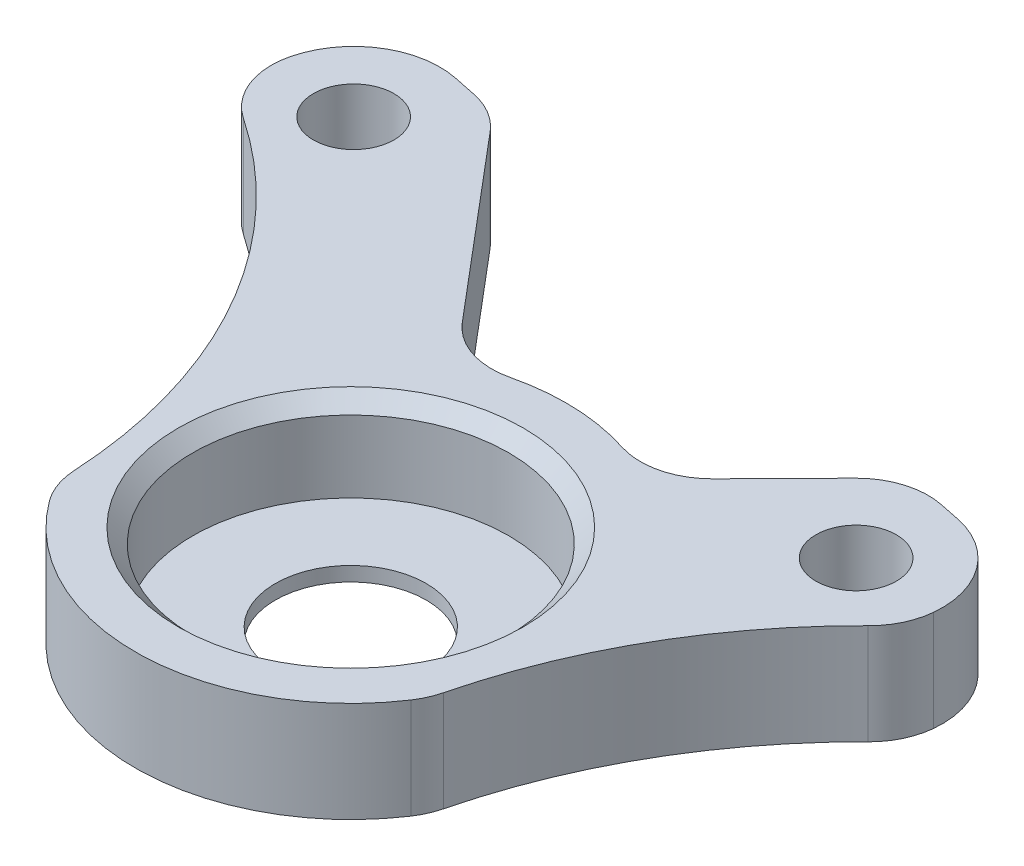
ISO-10303-21;
HEADER;
FILE_DESCRIPTION(('STEP AP214'),'2;1');
FILE_NAME('part.step','',(''),(''),'','','');
FILE_SCHEMA(('AUTOMOTIVE_DESIGN { 1 0 10303 214 1 1 1 1 }'));
ENDSEC;
DATA;
#1=APPLICATION_CONTEXT('core data for automotive mechanical design processes');
#2=APPLICATION_PROTOCOL_DEFINITION('international standard','automotive_design',2000,#1);
#3=PRODUCT_CONTEXT('',#1,'mechanical');
#4=PRODUCT('Part','Part','',(#3));
#5=PRODUCT_RELATED_PRODUCT_CATEGORY('part','',(#4));
#6=PRODUCT_DEFINITION_FORMATION('','',#4);
#7=PRODUCT_DEFINITION_CONTEXT('part definition',#1,'design');
#8=PRODUCT_DEFINITION('design','',#6,#7);
#9=PRODUCT_DEFINITION_SHAPE('','',#8);
#10=(LENGTH_UNIT() NAMED_UNIT(*) SI_UNIT(.MILLI.,.METRE.));
#11=(NAMED_UNIT(*) PLANE_ANGLE_UNIT() SI_UNIT($,.RADIAN.));
#12=(NAMED_UNIT(*) SI_UNIT($,.STERADIAN.) SOLID_ANGLE_UNIT());
#13=UNCERTAINTY_MEASURE_WITH_UNIT(LENGTH_MEASURE(1.E-05),#10,'distance_accuracy_value','');
#14=(GEOMETRIC_REPRESENTATION_CONTEXT(3) GLOBAL_UNCERTAINTY_ASSIGNED_CONTEXT((#13)) GLOBAL_UNIT_ASSIGNED_CONTEXT((#10,
#11,#12)) REPRESENTATION_CONTEXT('',''));
#15=CARTESIAN_POINT('',(0.,0.,0.));
#16=DIRECTION('',(0.,0.,1.));
#17=DIRECTION('',(1.,0.,0.));
#18=AXIS2_PLACEMENT_3D('',#15,#16,#17);
#19=CARTESIAN_POINT('',(-23.435152239211,6.,-30.7238893184095));
#20=DIRECTION('',(-0.202324195525961,0.,0.97931859979517));
#21=DIRECTION('',(0.97931859979517,0.,0.202324195525961));
#22=AXIS2_PLACEMENT_3D('',#19,#20,#21);
#23=PLANE('',#22);
#24=DIRECTION('',(-0.97931859979517,0.,-0.202324195525961));
#25=VECTOR('',#24,1.);
#26=CARTESIAN_POINT('',(-23.435152239211,6.,-30.7238893184095));
#27=LINE('',#26,#25);
#28=CARTESIAN_POINT('',(-21.8281383523247,6.,-30.3918852168522));
#29=VERTEX_POINT('',#28);
#30=CARTESIAN_POINT('',(-23.435152239211,6.,-30.7238893184095));
#31=VERTEX_POINT('',#30);
#32=EDGE_CURVE('E269',#29,#31,#27,.T.);
#33=ORIENTED_EDGE('',*,*,#32,.F.);
#34=DIRECTION('',(0.,1.,0.));
#35=VECTOR('',#34,1.);
#36=CARTESIAN_POINT('',(-21.8281383523247,6.,-30.3918852168522));
#37=LINE('',#36,#35);
#38=CARTESIAN_POINT('',(-21.8281383523247,-1.,-30.3918852168522));
#39=VERTEX_POINT('',#38);
#40=EDGE_CURVE('E200',#29,#39,#37,.F.);
#41=ORIENTED_EDGE('',*,*,#40,.T.);
#42=DIRECTION('',(0.97931859979517,0.,0.202324195525962));
#43=VECTOR('',#42,1.);
#44=CARTESIAN_POINT('',(-23.435152239211,-1.,-30.7238893184095));
#45=LINE('',#44,#43);
#46=CARTESIAN_POINT('',(-23.435152239211,-1.,-30.7238893184095));
#47=VERTEX_POINT('',#46);
#48=EDGE_CURVE('E180',#47,#39,#45,.T.);
#49=ORIENTED_EDGE('',*,*,#48,.F.);
#50=DIRECTION('',(0.,-1.,0.));
#51=VECTOR('',#50,1.);
#52=CARTESIAN_POINT('',(-23.435152239211,6.,-30.7238893184095));
#53=LINE('',#52,#51);
#54=EDGE_CURVE('E191',#31,#47,#53,.T.);
#55=ORIENTED_EDGE('',*,*,#54,.F.);
#56=EDGE_LOOP('',(#33,#41,#49,#55));
#57=FACE_BOUND('',#56,.T.);
#58=ADVANCED_FACE('F47',(#57),#23,.F.);
#59=CARTESIAN_POINT('',(0.,6.,0.));
#60=DIRECTION('',(0.,1.,0.));
#61=DIRECTION('',(0.,0.,1.));
#62=AXIS2_PLACEMENT_3D('',#59,#60,#61);
#63=PLANE('',#62);
#64=CARTESIAN_POINT('',(0.,6.,0.));
#65=DIRECTION('',(0.,1.,0.));
#66=DIRECTION('',(0.,0.,1.));
#67=AXIS2_PLACEMENT_3D('',#64,#65,#66);
#68=CIRCLE('',#67,15.);
#69=CARTESIAN_POINT('',(-12.0900974623236,6.,8.8786003036242));
#70=VERTEX_POINT('',#69);
#71=CARTESIAN_POINT('',(12.4953737752956,6.,8.29853205185444));
#72=VERTEX_POINT('',#71);
#73=EDGE_CURVE('E262',#70,#72,#68,.T.);
#74=ORIENTED_EDGE('',*,*,#73,.T.);
#75=CARTESIAN_POINT('',(8.33024918353037,6.,5.53235470123628));
#76=DIRECTION('',(0.,1.,0.));
#77=DIRECTION('',(0.,0.,1.));
#78=AXIS2_PLACEMENT_3D('',#75,#76,#77);
#79=CIRCLE('',#78,5.);
#80=CARTESIAN_POINT('',(13.1818907908236,6.,6.74131033085247));
#81=VERTEX_POINT('',#80);
#82=EDGE_CURVE('E332',#72,#81,#79,.T.);
#83=ORIENTED_EDGE('',*,*,#82,.T.);
#84=CARTESIAN_POINT('',(51.9950236491699,6.,16.412955367782));
#85=DIRECTION('',(0.,1.,0.));
#86=DIRECTION('',(0.,0.,1.));
#87=AXIS2_PLACEMENT_3D('',#84,#85,#86);
#88=CIRCLE('',#87,40.);
#89=CARTESIAN_POINT('',(23.9242574265755,6.,-12.0832212823662));
#90=VERTEX_POINT('',#89);
#91=EDGE_CURVE('E232',#90,#81,#88,.T.);
#92=ORIENTED_EDGE('',*,*,#91,.F.);
#93=CARTESIAN_POINT('',(20.4154116487512,6.,-15.6452433636347));
#94=DIRECTION('',(0.,1.,0.));
#95=DIRECTION('',(0.,0.,1.));
#96=AXIS2_PLACEMENT_3D('',#93,#94,#95);
#97=CIRCLE('',#96,5.);
#98=CARTESIAN_POINT('',(25.3912720004273,6.,-15.1545155769571));
#99=VERTEX_POINT('',#98);
#100=EDGE_CURVE('E326',#90,#99,#97,.T.);
#101=ORIENTED_EDGE('',*,*,#100,.T.);
#102=CARTESIAN_POINT('',(19.4202395784159,6.,-15.7433889209702));
#103=DIRECTION('',(0.,1.,0.));
#104=DIRECTION('',(0.,0.,-1.));
#105=AXIS2_PLACEMENT_3D('',#102,#103,#104);
#106=CIRCLE('',#105,6.);
#107=CARTESIAN_POINT('',(20.6341847515717,6.,-21.6193005197413));
#108=VERTEX_POINT('',#107);
#109=EDGE_CURVE('E266',#99,#108,#106,.T.);
#110=ORIENTED_EDGE('',*,*,#109,.T.);
#111=CARTESIAN_POINT('',(19.1682255894527,6.,-21.9221631511787));
#112=VERTEX_POINT('',#111);
#113=EDGE_CURVE('E270',#108,#112,#27,.T.);
#114=ORIENTED_EDGE('',*,*,#113,.T.);
#115=CARTESIAN_POINT('',(18.1566046118229,6.,-17.0255701522029));
#116=DIRECTION('',(0.,1.,0.));
#117=DIRECTION('',(0.,0.,1.));
#118=AXIS2_PLACEMENT_3D('',#115,#116,#117);
#119=CIRCLE('',#118,5.);
#120=CARTESIAN_POINT('',(14.5927242909585,6.,-20.5325285292806));
#121=VERTEX_POINT('',#120);
#122=EDGE_CURVE('E318',#112,#121,#119,.T.);
#123=ORIENTED_EDGE('',*,*,#122,.T.);
#124=DIRECTION('',(0.701391675415538,0.,-0.712776064172882));
#125=VECTOR('',#124,1.);
#126=CARTESIAN_POINT('',(7.28879756776038,6.,-13.1100507251578));
#127=LINE('',#126,#125);
#128=CARTESIAN_POINT('',(9.67615163065933,6.,-15.5361542738378));
#129=VERTEX_POINT('',#128);
#130=EDGE_CURVE('E242',#129,#121,#127,.T.);
#131=ORIENTED_EDGE('',*,*,#130,.F.);
#132=CARTESIAN_POINT('',(6.11227130979492,6.,-19.0431126509155));
#133=DIRECTION('',(0.,1.,0.));
#134=DIRECTION('',(0.,0.,1.));
#135=AXIS2_PLACEMENT_3D('',#132,#133,#134);
#136=CIRCLE('',#135,5.);
#137=CARTESIAN_POINT('',(4.58420348234619,6.,-14.2823344881866));
#138=VERTEX_POINT('',#137);
#139=EDGE_CURVE('E56',#129,#138,#136,.F.);
#140=ORIENTED_EDGE('',*,*,#139,.T.);
#141=CARTESIAN_POINT('',(0.,6.,0.));
#142=DIRECTION('',(0.,-1.,0.));
#143=DIRECTION('',(0.,0.,-1.));
#144=AXIS2_PLACEMENT_3D('',#141,#142,#143);
#145=CIRCLE('',#144,15.);
#146=CARTESIAN_POINT('',(-3.48577714933836,6.,-14.5893576851467));
#147=VERTEX_POINT('',#146);
#148=EDGE_CURVE('E236',#147,#138,#145,.T.);
#149=ORIENTED_EDGE('',*,*,#148,.F.);
#150=CARTESIAN_POINT('',(-4.64770286578448,6.,-19.452476913529));
#151=DIRECTION('',(0.,1.,0.));
#152=DIRECTION('',(0.,0.,1.));
#153=AXIS2_PLACEMENT_3D('',#150,#151,#152);
#154=CIRCLE('',#153,5.);
#155=CARTESIAN_POINT('',(-8.46774063057506,6.,-16.2264404172113));
#156=VERTEX_POINT('',#155);
#157=EDGE_CURVE('E375',#147,#156,#154,.F.);
#158=ORIENTED_EDGE('',*,*,#157,.T.);
#159=DIRECTION('',(0.645207299263541,0.,0.764007552958115));
#160=VECTOR('',#159,1.);
#161=CARTESIAN_POINT('',(-6.271623509002,6.,-13.6259582621309));
#162=LINE('',#161,#160);
#163=CARTESIAN_POINT('',(-19.0197215651639,6.,-28.7213287141941));
#164=VERTEX_POINT('',#163);
#165=EDGE_CURVE('E246',#164,#156,#162,.T.);
#166=ORIENTED_EDGE('',*,*,#165,.F.);
#167=CARTESIAN_POINT('',(-22.8397593299545,6.,-25.4952922178764));
#168=DIRECTION('',(0.,1.,0.));
#169=DIRECTION('',(0.,0.,1.));
#170=AXIS2_PLACEMENT_3D('',#167,#168,#169);
#171=CIRCLE('',#170,5.);
#172=EDGE_CURVE('E321',#164,#29,#171,.T.);
#173=ORIENTED_EDGE('',*,*,#172,.T.);
#174=ORIENTED_EDGE('',*,*,#32,.T.);
#175=CARTESIAN_POINT('',(-24.6490974123668,6.,-24.8479777196385));
#176=DIRECTION('',(0.,1.,0.));
#177=DIRECTION('',(0.,0.,-1.));
#178=AXIS2_PLACEMENT_3D('',#175,#176,#177);
#179=CIRCLE('',#178,6.00000000000001);
#180=CARTESIAN_POINT('',(-30.4770671423651,6.,-26.2744309527394));
#181=VERTEX_POINT('',#180);
#182=EDGE_CURVE('E193',#31,#181,#179,.T.);
#183=ORIENTED_EDGE('',*,*,#182,.T.);
#184=CARTESIAN_POINT('',(-25.6204257006997,6.,-25.0857199251553));
#185=DIRECTION('',(0.,1.,0.));
#186=DIRECTION('',(0.,0.,1.));
#187=AXIS2_PLACEMENT_3D('',#184,#185,#186);
#188=CIRCLE('',#187,5.);
#189=CARTESIAN_POINT('',(-28.4181722581908,6.,-20.9417346211217));
#190=VERTEX_POINT('',#189);
#191=EDGE_CURVE('E63',#181,#190,#188,.T.);
#192=ORIENTED_EDGE('',*,*,#191,.T.);
#193=CARTESIAN_POINT('',(-48.0023981606285,6.,8.06616250711379));
#194=DIRECTION('',(0.,1.,0.));
#195=DIRECTION('',(0.,0.,-1.));
#196=AXIS2_PLACEMENT_3D('',#193,#194,#195);
#197=CIRCLE('',#196,35.);
#198=CARTESIAN_POINT('',(-13.0528566231007,6.,6.18745382383667));
#199=VERTEX_POINT('',#198);
#200=EDGE_CURVE('E231',#199,#190,#197,.T.);
#201=ORIENTED_EDGE('',*,*,#200,.F.);
#202=CARTESIAN_POINT('',(-8.06006497488243,6.,5.9190668690828));
#203=DIRECTION('',(0.,1.,0.));
#204=DIRECTION('',(0.,0.,1.));
#205=AXIS2_PLACEMENT_3D('',#202,#203,#204);
#206=CIRCLE('',#205,5.);
#207=EDGE_CURVE('E329',#199,#70,#206,.T.);
#208=ORIENTED_EDGE('',*,*,#207,.T.);
#209=EDGE_LOOP('',(#74,#83,#92,#101,#110,#114,#123,#131,#140,#149,#158,#166,#173,#174,#183,#192,
#201,#208));
#210=FACE_BOUND('',#209,.T.);
#211=CARTESIAN_POINT('',(0.,6.,0.));
#212=DIRECTION('',(0.,1.,0.));
#213=DIRECTION('',(0.,0.,1.));
#214=AXIS2_PLACEMENT_3D('',#211,#212,#213);
#215=CIRCLE('',#214,12.);
#216=CARTESIAN_POINT('',(0.,6.,12.));
#217=VERTEX_POINT('',#216);
#218=EDGE_CURVE('E283',#217,#217,#215,.F.);
#219=ORIENTED_EDGE('',*,*,#218,.T.);
#220=EDGE_LOOP('',(#219));
#221=FACE_BOUND('',#220,.T.);
#222=CARTESIAN_POINT('',(19.4202395784159,6.,-15.7433889209702));
#223=DIRECTION('',(0.,1.,0.));
#224=DIRECTION('',(0.,0.,1.));
#225=AXIS2_PLACEMENT_3D('',#222,#223,#224);
#226=CIRCLE('',#225,2.8);
#227=CARTESIAN_POINT('',(19.4202395784159,6.,-12.9433889209702));
#228=VERTEX_POINT('',#227);
#229=EDGE_CURVE('E254',#228,#228,#226,.T.);
#230=ORIENTED_EDGE('',*,*,#229,.F.);
#231=EDGE_LOOP('',(#230));
#232=FACE_BOUND('',#231,.T.);
#233=CARTESIAN_POINT('',(-24.6490974123668,6.,-24.8479777196385));
#234=DIRECTION('',(0.,1.,0.));
#235=DIRECTION('',(0.,0.,1.));
#236=AXIS2_PLACEMENT_3D('',#233,#234,#235);
#237=CIRCLE('',#236,2.8);
#238=CARTESIAN_POINT('',(-24.6490974123668,6.,-22.0479777196385));
#239=VERTEX_POINT('',#238);
#240=EDGE_CURVE('E250',#239,#239,#237,.T.);
#241=ORIENTED_EDGE('',*,*,#240,.F.);
#242=EDGE_LOOP('',(#241));
#243=FACE_BOUND('',#242,.T.);
#244=ADVANCED_FACE('F383',(#210,#221,#232,#243),#63,.T.);
#245=CARTESIAN_POINT('',(0.,6.,0.));
#246=DIRECTION('',(0.,-1.,0.));
#247=DIRECTION('',(0.,0.,-1.));
#248=AXIS2_PLACEMENT_3D('',#245,#246,#247);
#249=CYLINDRICAL_SURFACE('',#248,15.);
#250=CARTESIAN_POINT('',(0.,-1.,0.));
#251=DIRECTION('',(0.,-1.,0.));
#252=DIRECTION('',(0.,0.,-1.));
#253=AXIS2_PLACEMENT_3D('',#250,#251,#252);
#254=CIRCLE('',#253,15.);
#255=CARTESIAN_POINT('',(12.4953737752956,-1.,8.29853205185444));
#256=VERTEX_POINT('',#255);
#257=CARTESIAN_POINT('',(-12.0900974623236,-1.,8.8786003036242));
#258=VERTEX_POINT('',#257);
#259=EDGE_CURVE('E227',#256,#258,#254,.T.);
#260=ORIENTED_EDGE('',*,*,#259,.F.);
#261=DIRECTION('',(0.,-1.,0.));
#262=VECTOR('',#261,1.);
#263=CARTESIAN_POINT('',(12.4953737752956,6.,8.29853205185444));
#264=LINE('',#263,#262);
#265=EDGE_CURVE('E315',#256,#72,#264,.F.);
#266=ORIENTED_EDGE('',*,*,#265,.T.);
#267=ORIENTED_EDGE('',*,*,#73,.F.);
#268=DIRECTION('',(0.,-1.,0.));
#269=VECTOR('',#268,1.);
#270=CARTESIAN_POINT('',(-12.0900974623236,6.,8.8786003036242));
#271=LINE('',#270,#269);
#272=EDGE_CURVE('E311',#70,#258,#271,.T.);
#273=ORIENTED_EDGE('',*,*,#272,.T.);
#274=EDGE_LOOP('',(#260,#266,#267,#273));
#275=FACE_BOUND('',#274,.T.);
#276=ADVANCED_FACE('F426',(#275),#249,.T.);
#277=CARTESIAN_POINT('',(19.4202395784159,6.,-15.7433889209702));
#278=DIRECTION('',(0.,-1.,0.));
#279=DIRECTION('',(0.,0.,-1.));
#280=AXIS2_PLACEMENT_3D('',#277,#278,#279);
#281=CYLINDRICAL_SURFACE('',#280,6.);
#282=ORIENTED_EDGE('',*,*,#109,.F.);
#283=DIRECTION('',(0.,-1.,0.));
#284=VECTOR('',#283,1.);
#285=CARTESIAN_POINT('',(25.3912720004273,6.,-15.1545155769571));
#286=LINE('',#285,#284);
#287=CARTESIAN_POINT('',(25.3912720004273,-1.,-15.1545155769571));
#288=VERTEX_POINT('',#287);
#289=EDGE_CURVE('E341',#99,#288,#286,.T.);
#290=ORIENTED_EDGE('',*,*,#289,.T.);
#291=CARTESIAN_POINT('',(19.4202395784159,-1.,-15.7433889209702));
#292=DIRECTION('',(0.,-1.,0.));
#293=DIRECTION('',(0.,0.,-1.));
#294=AXIS2_PLACEMENT_3D('',#291,#292,#293);
#295=CIRCLE('',#294,6.);
#296=CARTESIAN_POINT('',(20.6341847515717,-1.,-21.6193005197413));
#297=VERTEX_POINT('',#296);
#298=EDGE_CURVE('E220',#297,#288,#295,.T.);
#299=ORIENTED_EDGE('',*,*,#298,.F.);
#300=DIRECTION('',(0.,-1.,0.));
#301=VECTOR('',#300,1.);
#302=CARTESIAN_POINT('',(20.6341847515717,6.,-21.6193005197413));
#303=LINE('',#302,#301);
#304=EDGE_CURVE('E197',#108,#297,#303,.T.);
#305=ORIENTED_EDGE('',*,*,#304,.F.);
#306=EDGE_LOOP('',(#282,#290,#299,#305));
#307=FACE_BOUND('',#306,.T.);
#308=ADVANCED_FACE('F409',(#307),#281,.T.);
#309=DIRECTION('',(0.97931859979517,0.,0.202324195525964));
#310=VECTOR('',#309,1.);
#311=CARTESIAN_POINT('',(16.5021661316794,-1.,-22.4729627940439));
#312=LINE('',#311,#310);
#313=CARTESIAN_POINT('',(19.1682255894527,-1.,-21.9221631511787));
#314=VERTEX_POINT('',#313);
#315=EDGE_CURVE('E217',#314,#297,#312,.T.);
#316=ORIENTED_EDGE('',*,*,#315,.F.);
#317=DIRECTION('',(0.,1.,0.));
#318=VECTOR('',#317,1.);
#319=CARTESIAN_POINT('',(19.1682255894527,6.,-21.9221631511787));
#320=LINE('',#319,#318);
#321=EDGE_CURVE('E371',#314,#112,#320,.T.);
#322=ORIENTED_EDGE('',*,*,#321,.T.);
#323=ORIENTED_EDGE('',*,*,#113,.F.);
#324=ORIENTED_EDGE('',*,*,#304,.T.);
#325=EDGE_LOOP('',(#316,#322,#323,#324));
#326=FACE_BOUND('',#325,.T.);
#327=ADVANCED_FACE('F403',(#326),#23,.F.);
#328=CARTESIAN_POINT('',(-24.6490974123668,6.,-24.8479777196385));
#329=DIRECTION('',(0.,-1.,0.));
#330=DIRECTION('',(0.,0.,-1.));
#331=AXIS2_PLACEMENT_3D('',#328,#329,#330);
#332=CYLINDRICAL_SURFACE('',#331,6.00000000000001);
#333=CARTESIAN_POINT('',(-24.6490974123668,-1.,-24.8479777196385));
#334=DIRECTION('',(0.,-1.,0.));
#335=DIRECTION('',(0.,0.,-1.));
#336=AXIS2_PLACEMENT_3D('',#333,#334,#335);
#337=CIRCLE('',#336,6.00000000000002);
#338=CARTESIAN_POINT('',(-30.4770671423651,-1.,-26.2744309527394));
#339=VERTEX_POINT('',#338);
#340=EDGE_CURVE('E174',#339,#47,#337,.T.);
#341=ORIENTED_EDGE('',*,*,#340,.F.);
#342=DIRECTION('',(0.,-1.,0.));
#343=VECTOR('',#342,1.);
#344=CARTESIAN_POINT('',(-30.4770671423651,6.,-26.2744309527394));
#345=LINE('',#344,#343);
#346=EDGE_CURVE('E345',#339,#181,#345,.F.);
#347=ORIENTED_EDGE('',*,*,#346,.T.);
#348=ORIENTED_EDGE('',*,*,#182,.F.);
#349=ORIENTED_EDGE('',*,*,#54,.T.);
#350=EDGE_LOOP('',(#341,#347,#348,#349));
#351=FACE_BOUND('',#350,.T.);
#352=ADVANCED_FACE('F192',(#351),#332,.T.);
#353=CARTESIAN_POINT('',(0.,6.,0.));
#354=DIRECTION('',(0.,-1.,0.));
#355=DIRECTION('',(0.,0.,-1.));
#356=AXIS2_PLACEMENT_3D('',#353,#354,#355);
#357=CYLINDRICAL_SURFACE('',#356,11.);
#358=CARTESIAN_POINT('',(0.,5.,0.));
#359=DIRECTION('',(0.,1.,0.));
#360=DIRECTION('',(0.,0.,1.));
#361=AXIS2_PLACEMENT_3D('',#358,#359,#360);
#362=CIRCLE('',#361,11.);
#363=CARTESIAN_POINT('',(0.,5.,11.));
#364=VERTEX_POINT('',#363);
#365=EDGE_CURVE('E279',#364,#364,#362,.T.);
#366=ORIENTED_EDGE('',*,*,#365,.T.);
#367=EDGE_LOOP('',(#366));
#368=FACE_BOUND('',#367,.T.);
#369=CARTESIAN_POINT('',(0.,0.,0.));
#370=DIRECTION('',(0.,1.,0.));
#371=DIRECTION('',(0.,0.,1.));
#372=AXIS2_PLACEMENT_3D('',#369,#370,#371);
#373=CIRCLE('',#372,11.);
#374=CARTESIAN_POINT('',(0.,0.,11.));
#375=VERTEX_POINT('',#374);
#376=EDGE_CURVE('E258',#375,#375,#373,.T.);
#377=ORIENTED_EDGE('',*,*,#376,.F.);
#378=EDGE_LOOP('',(#377));
#379=FACE_BOUND('',#378,.T.);
#380=ADVANCED_FACE('F483',(#368,#379),#357,.F.);
#381=CARTESIAN_POINT('',(19.4202395784159,6.,-15.7433889209702));
#382=DIRECTION('',(0.,-1.,0.));
#383=DIRECTION('',(0.,0.,-1.));
#384=AXIS2_PLACEMENT_3D('',#381,#382,#383);
#385=CYLINDRICAL_SURFACE('',#384,2.8);
#386=ORIENTED_EDGE('',*,*,#229,.T.);
#387=EDGE_LOOP('',(#386));
#388=FACE_BOUND('',#387,.T.);
#389=CARTESIAN_POINT('',(19.4202395784159,-1.,-15.7433889209702));
#390=DIRECTION('',(0.,-1.,0.));
#391=DIRECTION('',(0.,0.,-1.));
#392=AXIS2_PLACEMENT_3D('',#389,#390,#391);
#393=CIRCLE('',#392,2.8);
#394=CARTESIAN_POINT('',(19.4202395784159,-1.,-18.5433889209702));
#395=VERTEX_POINT('',#394);
#396=EDGE_CURVE('E435',#395,#395,#393,.T.);
#397=ORIENTED_EDGE('',*,*,#396,.T.);
#398=EDGE_LOOP('',(#397));
#399=FACE_BOUND('',#398,.T.);
#400=ADVANCED_FACE('F638',(#388,#399),#385,.F.);
#401=CARTESIAN_POINT('',(-24.6490974123668,6.,-24.8479777196385));
#402=DIRECTION('',(0.,-1.,0.));
#403=DIRECTION('',(0.,0.,-1.));
#404=AXIS2_PLACEMENT_3D('',#401,#402,#403);
#405=CYLINDRICAL_SURFACE('',#404,2.8);
#406=ORIENTED_EDGE('',*,*,#240,.T.);
#407=EDGE_LOOP('',(#406));
#408=FACE_BOUND('',#407,.T.);
#409=CARTESIAN_POINT('',(-24.6490974123668,-1.,-24.8479777196385));
#410=DIRECTION('',(0.,-1.,0.));
#411=DIRECTION('',(0.,0.,-1.));
#412=AXIS2_PLACEMENT_3D('',#409,#410,#411);
#413=CIRCLE('',#412,2.8);
#414=CARTESIAN_POINT('',(-24.6490974123668,-1.,-27.6479777196385));
#415=VERTEX_POINT('',#414);
#416=EDGE_CURVE('E438',#415,#415,#413,.T.);
#417=ORIENTED_EDGE('',*,*,#416,.T.);
#418=EDGE_LOOP('',(#417));
#419=FACE_BOUND('',#418,.T.);
#420=ADVANCED_FACE('F627',(#408,#419),#405,.F.);
#421=CARTESIAN_POINT('',(0.,-0.00100000000000013,0.));
#422=DIRECTION('',(0.,1.,0.));
#423=DIRECTION('',(0.,0.,1.));
#424=AXIS2_PLACEMENT_3D('',#421,#422,#423);
#425=CYLINDRICAL_SURFACE('',#424,15.);
#426=CARTESIAN_POINT('',(0.,-1.,0.));
#427=DIRECTION('',(0.,-1.,0.));
#428=DIRECTION('',(0.,0.,-1.));
#429=AXIS2_PLACEMENT_3D('',#426,#427,#428);
#430=CIRCLE('',#429,15.);
#431=CARTESIAN_POINT('',(-3.48577714933836,-1.,-14.5893576851467));
#432=VERTEX_POINT('',#431);
#433=CARTESIAN_POINT('',(4.58420348234619,-1.,-14.2823344881866));
#434=VERTEX_POINT('',#433);
#435=EDGE_CURVE('E206',#432,#434,#430,.T.);
#436=ORIENTED_EDGE('',*,*,#435,.F.);
#437=DIRECTION('',(0.,1.,0.));
#438=VECTOR('',#437,1.);
#439=CARTESIAN_POINT('',(-3.48577714933836,-0.00100000000000013,-14.5893576851467));
#440=LINE('',#439,#438);
#441=EDGE_CURVE('E360',#432,#147,#440,.T.);
#442=ORIENTED_EDGE('',*,*,#441,.T.);
#443=ORIENTED_EDGE('',*,*,#148,.T.);
#444=DIRECTION('',(0.,1.,0.));
#445=VECTOR('',#444,1.);
#446=CARTESIAN_POINT('',(4.58420348234619,-0.00100000000000013,-14.2823344881866));
#447=LINE('',#446,#445);
#448=EDGE_CURVE('E357',#138,#434,#447,.F.);
#449=ORIENTED_EDGE('',*,*,#448,.T.);
#450=EDGE_LOOP('',(#436,#442,#443,#449));
#451=FACE_BOUND('',#450,.T.);
#452=ADVANCED_FACE('F390',(#451),#425,.T.);
#453=CARTESIAN_POINT('',(-6.271623509002,-0.00100000000000013,-13.6259582621309));
#454=DIRECTION('',(-0.764007552958115,0.,0.645207299263541));
#455=DIRECTION('',(0.645207299263541,0.,0.764007552958115));
#456=AXIS2_PLACEMENT_3D('',#453,#454,#455);
#457=PLANE('',#456);
#458=DIRECTION('',(0.645207299263541,0.,0.764007552958115));
#459=VECTOR('',#458,1.);
#460=CARTESIAN_POINT('',(-20.1351306894507,-1.,-30.042115066993));
#461=LINE('',#460,#459);
#462=CARTESIAN_POINT('',(-19.0197215651639,-1.,-28.7213287141941));
#463=VERTEX_POINT('',#462);
#464=CARTESIAN_POINT('',(-8.46774063057506,-1.,-16.2264404172113));
#465=VERTEX_POINT('',#464);
#466=EDGE_CURVE('E202',#463,#465,#461,.T.);
#467=ORIENTED_EDGE('',*,*,#466,.F.);
#468=DIRECTION('',(0.,1.,0.));
#469=VECTOR('',#468,1.);
#470=CARTESIAN_POINT('',(-19.0197215651639,-0.00100000000000013,-28.7213287141941));
#471=LINE('',#470,#469);
#472=EDGE_CURVE('E351',#463,#164,#471,.T.);
#473=ORIENTED_EDGE('',*,*,#472,.T.);
#474=ORIENTED_EDGE('',*,*,#165,.T.);
#475=DIRECTION('',(0.,-1.,0.));
#476=VECTOR('',#475,1.);
#477=CARTESIAN_POINT('',(-8.46774063057506,-1.,-16.2264404172113));
#478=LINE('',#477,#476);
#479=EDGE_CURVE('E348',#156,#465,#478,.T.);
#480=ORIENTED_EDGE('',*,*,#479,.T.);
#481=EDGE_LOOP('',(#467,#473,#474,#480));
#482=FACE_BOUND('',#481,.T.);
#483=ADVANCED_FACE('F605',(#482),#457,.F.);
#484=CARTESIAN_POINT('',(7.28879756776038,-0.00100000000000013,-13.1100507251578));
#485=DIRECTION('',(0.712776064172882,0.,0.701391675415538));
#486=DIRECTION('',(0.701391675415538,0.,-0.712776064172882));
#487=AXIS2_PLACEMENT_3D('',#484,#485,#486);
#488=PLANE('',#487);
#489=DIRECTION('',(0.701391675415538,0.,-0.712776064172882));
#490=VECTOR('',#489,1.);
#491=CARTESIAN_POINT('',(7.28879756776037,-1.,-13.1100507251578));
#492=LINE('',#491,#490);
#493=CARTESIAN_POINT('',(9.67615163065933,-1.,-15.5361542738378));
#494=VERTEX_POINT('',#493);
#495=CARTESIAN_POINT('',(14.5927242909585,-1.,-20.5325285292806));
#496=VERTEX_POINT('',#495);
#497=EDGE_CURVE('E213',#494,#496,#492,.T.);
#498=ORIENTED_EDGE('',*,*,#497,.F.);
#499=DIRECTION('',(0.,-1.,0.));
#500=VECTOR('',#499,1.);
#501=CARTESIAN_POINT('',(9.67615163065933,6.,-15.5361542738378));
#502=LINE('',#501,#500);
#503=EDGE_CURVE('E367',#494,#129,#502,.F.);
#504=ORIENTED_EDGE('',*,*,#503,.T.);
#505=ORIENTED_EDGE('',*,*,#130,.T.);
#506=DIRECTION('',(0.,1.,0.));
#507=VECTOR('',#506,1.);
#508=CARTESIAN_POINT('',(14.5927242909585,-0.00100000000000013,-20.5325285292806));
#509=LINE('',#508,#507);
#510=EDGE_CURVE('E364',#121,#496,#509,.F.);
#511=ORIENTED_EDGE('',*,*,#510,.T.);
#512=EDGE_LOOP('',(#498,#504,#505,#511));
#513=FACE_BOUND('',#512,.T.);
#514=ADVANCED_FACE('F397',(#513),#488,.F.);
#515=CARTESIAN_POINT('',(0.,5.,0.));
#516=DIRECTION('',(0.,1.,0.));
#517=DIRECTION('',(0.,0.,1.));
#518=AXIS2_PLACEMENT_3D('',#515,#516,#517);
#519=CONICAL_SURFACE('',#518,11.,0.785398163397447);
#520=ORIENTED_EDGE('',*,*,#218,.F.);
#521=EDGE_LOOP('',(#520));
#522=FACE_BOUND('',#521,.T.);
#523=ORIENTED_EDGE('',*,*,#365,.F.);
#524=EDGE_LOOP('',(#523));
#525=FACE_BOUND('',#524,.T.);
#526=ADVANCED_FACE('F490',(#522,#525),#519,.F.);
#527=CARTESIAN_POINT('',(-48.0023981606285,0.,8.06616250711379));
#528=DIRECTION('',(0.,1.,0.));
#529=DIRECTION('',(0.,0.,1.));
#530=AXIS2_PLACEMENT_3D('',#527,#528,#529);
#531=CYLINDRICAL_SURFACE('',#530,35.);
#532=CARTESIAN_POINT('',(-48.0023981606285,-1.,8.06616250711379));
#533=DIRECTION('',(0.,1.,0.));
#534=DIRECTION('',(0.,0.,-1.));
#535=AXIS2_PLACEMENT_3D('',#532,#533,#534);
#536=CIRCLE('',#535,35.);
#537=CARTESIAN_POINT('',(-13.0528566231007,-1.,6.18745382383667));
#538=VERTEX_POINT('',#537);
#539=CARTESIAN_POINT('',(-28.4181722581908,-1.,-20.9417346211217));
#540=VERTEX_POINT('',#539);
#541=EDGE_CURVE('E187',#538,#540,#536,.T.);
#542=ORIENTED_EDGE('',*,*,#541,.F.);
#543=DIRECTION('',(0.,1.,0.));
#544=VECTOR('',#543,1.);
#545=CARTESIAN_POINT('',(-13.0528566231007,0.,6.18745382383667));
#546=LINE('',#545,#544);
#547=EDGE_CURVE('E70',#538,#199,#546,.T.);
#548=ORIENTED_EDGE('',*,*,#547,.T.);
#549=ORIENTED_EDGE('',*,*,#200,.T.);
#550=DIRECTION('',(0.,1.,0.));
#551=VECTOR('',#550,1.);
#552=CARTESIAN_POINT('',(-28.4181722581908,0.,-20.9417346211217));
#553=LINE('',#552,#551);
#554=EDGE_CURVE('E335',#190,#540,#553,.F.);
#555=ORIENTED_EDGE('',*,*,#554,.T.);
#556=EDGE_LOOP('',(#542,#548,#549,#555));
#557=FACE_BOUND('',#556,.T.);
#558=ADVANCED_FACE('F432',(#557),#531,.F.);
#559=CARTESIAN_POINT('',(51.9950236491699,0.,16.412955367782));
#560=DIRECTION('',(0.,1.,0.));
#561=DIRECTION('',(0.,0.,1.));
#562=AXIS2_PLACEMENT_3D('',#559,#560,#561);
#563=CYLINDRICAL_SURFACE('',#562,40.);
#564=ORIENTED_EDGE('',*,*,#91,.T.);
#565=DIRECTION('',(0.,1.,0.));
#566=VECTOR('',#565,1.);
#567=CARTESIAN_POINT('',(13.1818907908236,0.,6.74131033085247));
#568=LINE('',#567,#566);
#569=CARTESIAN_POINT('',(13.1818907908236,-1.,6.74131033085247));
#570=VERTEX_POINT('',#569);
#571=EDGE_CURVE('E290',#81,#570,#568,.F.);
#572=ORIENTED_EDGE('',*,*,#571,.T.);
#573=CARTESIAN_POINT('',(51.9950236491699,-1.,16.412955367782));
#574=DIRECTION('',(0.,1.,0.));
#575=DIRECTION('',(0.,0.,-1.));
#576=AXIS2_PLACEMENT_3D('',#573,#574,#575);
#577=CIRCLE('',#576,40.);
#578=CARTESIAN_POINT('',(23.9242574265755,-1.,-12.0832212823662));
#579=VERTEX_POINT('',#578);
#580=EDGE_CURVE('E224',#579,#570,#577,.T.);
#581=ORIENTED_EDGE('',*,*,#580,.F.);
#582=DIRECTION('',(0.,1.,0.));
#583=VECTOR('',#582,1.);
#584=CARTESIAN_POINT('',(23.9242574265755,0.,-12.0832212823662));
#585=LINE('',#584,#583);
#586=EDGE_CURVE('E287',#579,#90,#585,.T.);
#587=ORIENTED_EDGE('',*,*,#586,.T.);
#588=EDGE_LOOP('',(#564,#572,#581,#587));
#589=FACE_BOUND('',#588,.T.);
#590=ADVANCED_FACE('F415',(#589),#563,.F.);
#591=CARTESIAN_POINT('',(-48.0023981606285,0.,8.06616250711379));
#592=DIRECTION('',(0.,-1.,0.));
#593=DIRECTION('',(0.,0.,-1.));
#594=AXIS2_PLACEMENT_3D('',#591,#592,#593);
#595=PLANE('',#594);
#596=CARTESIAN_POINT('',(0.,0.,0.));
#597=DIRECTION('',(0.,-1.,0.));
#598=DIRECTION('',(0.,0.,-1.));
#599=AXIS2_PLACEMENT_3D('',#596,#597,#598);
#600=CIRCLE('',#599,5.25);
#601=CARTESIAN_POINT('',(0.,0.,-5.25));
#602=VERTEX_POINT('',#601);
#603=EDGE_CURVE('E445',#602,#602,#600,.T.);
#604=ORIENTED_EDGE('',*,*,#603,.T.);
#605=EDGE_LOOP('',(#604));
#606=FACE_BOUND('',#605,.T.);
#607=ORIENTED_EDGE('',*,*,#376,.T.);
#608=EDGE_LOOP('',(#607));
#609=FACE_BOUND('',#608,.T.);
#610=ADVANCED_FACE('F457',(#606,#609),#595,.F.);
#611=CARTESIAN_POINT('',(-48.0023981606285,-1.,8.06616250711379));
#612=DIRECTION('',(0.,-1.,0.));
#613=DIRECTION('',(0.,0.,-1.));
#614=AXIS2_PLACEMENT_3D('',#611,#612,#613);
#615=PLANE('',#614);
#616=ORIENTED_EDGE('',*,*,#416,.F.);
#617=EDGE_LOOP('',(#616));
#618=FACE_BOUND('',#617,.T.);
#619=ORIENTED_EDGE('',*,*,#580,.T.);
#620=CARTESIAN_POINT('',(8.33024918353037,-1.,5.53235470123628));
#621=DIRECTION('',(0.,-1.,0.));
#622=DIRECTION('',(0.,0.,-1.));
#623=AXIS2_PLACEMENT_3D('',#620,#621,#622);
#624=CIRCLE('',#623,5.);
#625=EDGE_CURVE('E308',#570,#256,#624,.T.);
#626=ORIENTED_EDGE('',*,*,#625,.T.);
#627=ORIENTED_EDGE('',*,*,#259,.T.);
#628=CARTESIAN_POINT('',(-8.06006497488243,-1.,5.9190668690828));
#629=DIRECTION('',(0.,-1.,0.));
#630=DIRECTION('',(0.,0.,-1.));
#631=AXIS2_PLACEMENT_3D('',#628,#629,#630);
#632=CIRCLE('',#631,5.);
#633=EDGE_CURVE('E305',#258,#538,#632,.T.);
#634=ORIENTED_EDGE('',*,*,#633,.T.);
#635=ORIENTED_EDGE('',*,*,#541,.T.);
#636=CARTESIAN_POINT('',(-25.6204257006997,-1.,-25.0857199251553));
#637=DIRECTION('',(0.,-1.,0.));
#638=DIRECTION('',(0.,0.,-1.));
#639=AXIS2_PLACEMENT_3D('',#636,#637,#638);
#640=CIRCLE('',#639,5.);
#641=EDGE_CURVE('E183',#540,#339,#640,.T.);
#642=ORIENTED_EDGE('',*,*,#641,.T.);
#643=ORIENTED_EDGE('',*,*,#340,.T.);
#644=ORIENTED_EDGE('',*,*,#48,.T.);
#645=CARTESIAN_POINT('',(-22.8397593299545,-1.,-25.4952922178764));
#646=DIRECTION('',(0.,-1.,0.));
#647=DIRECTION('',(0.,0.,-1.));
#648=AXIS2_PLACEMENT_3D('',#645,#646,#647);
#649=CIRCLE('',#648,5.);
#650=EDGE_CURVE('E297',#39,#463,#649,.T.);
#651=ORIENTED_EDGE('',*,*,#650,.T.);
#652=ORIENTED_EDGE('',*,*,#466,.T.);
#653=CARTESIAN_POINT('',(-4.64770286578448,-1.,-19.452476913529));
#654=DIRECTION('',(0.,-1.,0.));
#655=DIRECTION('',(0.,0.,-1.));
#656=AXIS2_PLACEMENT_3D('',#653,#654,#655);
#657=CIRCLE('',#656,5.);
#658=EDGE_CURVE('E378',#465,#432,#657,.F.);
#659=ORIENTED_EDGE('',*,*,#658,.T.);
#660=ORIENTED_EDGE('',*,*,#435,.T.);
#661=CARTESIAN_POINT('',(6.11227130979492,-1.,-19.0431126509155));
#662=DIRECTION('',(0.,-1.,0.));
#663=DIRECTION('',(0.,0.,-1.));
#664=AXIS2_PLACEMENT_3D('',#661,#662,#663);
#665=CIRCLE('',#664,5.);
#666=EDGE_CURVE('E11',#434,#494,#665,.F.);
#667=ORIENTED_EDGE('',*,*,#666,.T.);
#668=ORIENTED_EDGE('',*,*,#497,.T.);
#669=CARTESIAN_POINT('',(18.1566046118229,-1.,-17.0255701522029));
#670=DIRECTION('',(0.,-1.,0.));
#671=DIRECTION('',(0.,0.,-1.));
#672=AXIS2_PLACEMENT_3D('',#669,#670,#671);
#673=CIRCLE('',#672,5.);
#674=EDGE_CURVE('E294',#496,#314,#673,.T.);
#675=ORIENTED_EDGE('',*,*,#674,.T.);
#676=ORIENTED_EDGE('',*,*,#315,.T.);
#677=ORIENTED_EDGE('',*,*,#298,.T.);
#678=CARTESIAN_POINT('',(20.4154116487512,-1.,-15.6452433636347));
#679=DIRECTION('',(0.,-1.,0.));
#680=DIRECTION('',(0.,0.,-1.));
#681=AXIS2_PLACEMENT_3D('',#678,#679,#680);
#682=CIRCLE('',#681,5.);
#683=EDGE_CURVE('E302',#288,#579,#682,.T.);
#684=ORIENTED_EDGE('',*,*,#683,.T.);
#685=EDGE_LOOP('',(#619,#626,#627,#634,#635,#642,#643,#644,#651,#652,#659,#660,#667,#668,#675,
#676,#677,#684));
#686=FACE_BOUND('',#685,.T.);
#687=ORIENTED_EDGE('',*,*,#396,.F.);
#688=EDGE_LOOP('',(#687));
#689=FACE_BOUND('',#688,.T.);
#690=CARTESIAN_POINT('',(0.,-1.,0.));
#691=DIRECTION('',(0.,-1.,0.));
#692=DIRECTION('',(0.,0.,-1.));
#693=AXIS2_PLACEMENT_3D('',#690,#691,#692);
#694=CIRCLE('',#693,5.25);
#695=CARTESIAN_POINT('',(0.,-1.,-5.25));
#696=VERTEX_POINT('',#695);
#697=EDGE_CURVE('E444',#696,#696,#694,.T.);
#698=ORIENTED_EDGE('',*,*,#697,.F.);
#699=EDGE_LOOP('',(#698));
#700=FACE_BOUND('',#699,.T.);
#701=ADVANCED_FACE('F177',(#618,#686,#689,#700),#615,.T.);
#702=CARTESIAN_POINT('',(0.,-1.,0.));
#703=DIRECTION('',(0.,1.,0.));
#704=DIRECTION('',(0.,0.,1.));
#705=AXIS2_PLACEMENT_3D('',#702,#703,#704);
#706=CYLINDRICAL_SURFACE('',#705,5.25);
#707=ORIENTED_EDGE('',*,*,#697,.T.);
#708=EDGE_LOOP('',(#707));
#709=FACE_BOUND('',#708,.T.);
#710=ORIENTED_EDGE('',*,*,#603,.F.);
#711=EDGE_LOOP('',(#710));
#712=FACE_BOUND('',#711,.T.);
#713=ADVANCED_FACE('F453',(#709,#712),#706,.F.);
#714=CARTESIAN_POINT('',(8.33024918353037,6.,5.53235470123628));
#715=DIRECTION('',(0.,1.,0.));
#716=DIRECTION('',(0.,0.,1.));
#717=AXIS2_PLACEMENT_3D('',#714,#715,#716);
#718=CYLINDRICAL_SURFACE('',#717,5.);
#719=ORIENTED_EDGE('',*,*,#82,.F.);
#720=ORIENTED_EDGE('',*,*,#265,.F.);
#721=ORIENTED_EDGE('',*,*,#625,.F.);
#722=ORIENTED_EDGE('',*,*,#571,.F.);
#723=EDGE_LOOP('',(#719,#720,#721,#722));
#724=FACE_BOUND('',#723,.T.);
#725=ADVANCED_FACE('F422',(#724),#718,.T.);
#726=CARTESIAN_POINT('',(-8.06006497488243,0.,5.9190668690828));
#727=DIRECTION('',(0.,1.,0.));
#728=DIRECTION('',(0.,0.,1.));
#729=AXIS2_PLACEMENT_3D('',#726,#727,#728);
#730=CYLINDRICAL_SURFACE('',#729,5.);
#731=ORIENTED_EDGE('',*,*,#207,.F.);
#732=ORIENTED_EDGE('',*,*,#547,.F.);
#733=ORIENTED_EDGE('',*,*,#633,.F.);
#734=ORIENTED_EDGE('',*,*,#272,.F.);
#735=EDGE_LOOP('',(#731,#732,#733,#734));
#736=FACE_BOUND('',#735,.T.);
#737=ADVANCED_FACE('F431',(#736),#730,.T.);
#738=CARTESIAN_POINT('',(20.4154116487512,0.,-15.6452433636347));
#739=DIRECTION('',(0.,1.,0.));
#740=DIRECTION('',(0.,0.,1.));
#741=AXIS2_PLACEMENT_3D('',#738,#739,#740);
#742=CYLINDRICAL_SURFACE('',#741,5.);
#743=ORIENTED_EDGE('',*,*,#100,.F.);
#744=ORIENTED_EDGE('',*,*,#586,.F.);
#745=ORIENTED_EDGE('',*,*,#683,.F.);
#746=ORIENTED_EDGE('',*,*,#289,.F.);
#747=EDGE_LOOP('',(#743,#744,#745,#746));
#748=FACE_BOUND('',#747,.T.);
#749=ADVANCED_FACE('F419',(#748),#742,.T.);
#750=CARTESIAN_POINT('',(-25.6204257006997,6.,-25.0857199251553));
#751=DIRECTION('',(0.,1.,0.));
#752=DIRECTION('',(0.,0.,1.));
#753=AXIS2_PLACEMENT_3D('',#750,#751,#752);
#754=CYLINDRICAL_SURFACE('',#753,5.);
#755=ORIENTED_EDGE('',*,*,#191,.F.);
#756=ORIENTED_EDGE('',*,*,#346,.F.);
#757=ORIENTED_EDGE('',*,*,#641,.F.);
#758=ORIENTED_EDGE('',*,*,#554,.F.);
#759=EDGE_LOOP('',(#755,#756,#757,#758));
#760=FACE_BOUND('',#759,.T.);
#761=ADVANCED_FACE('F501',(#760),#754,.T.);
#762=CARTESIAN_POINT('',(-22.8397593299545,-0.00100000000000013,-25.4952922178764));
#763=DIRECTION('',(0.,1.,0.));
#764=DIRECTION('',(0.,0.,1.));
#765=AXIS2_PLACEMENT_3D('',#762,#763,#764);
#766=CYLINDRICAL_SURFACE('',#765,5.);
#767=ORIENTED_EDGE('',*,*,#650,.F.);
#768=ORIENTED_EDGE('',*,*,#40,.F.);
#769=ORIENTED_EDGE('',*,*,#172,.F.);
#770=ORIENTED_EDGE('',*,*,#472,.F.);
#771=EDGE_LOOP('',(#767,#768,#769,#770));
#772=FACE_BOUND('',#771,.T.);
#773=ADVANCED_FACE('F504',(#772),#766,.T.);
#774=CARTESIAN_POINT('',(-4.64770286578448,-0.00100000000000013,-19.452476913529));
#775=DIRECTION('',(0.,1.,0.));
#776=DIRECTION('',(0.,0.,1.));
#777=AXIS2_PLACEMENT_3D('',#774,#775,#776);
#778=CYLINDRICAL_SURFACE('',#777,5.);
#779=ORIENTED_EDGE('',*,*,#658,.F.);
#780=ORIENTED_EDGE('',*,*,#479,.F.);
#781=ORIENTED_EDGE('',*,*,#157,.F.);
#782=ORIENTED_EDGE('',*,*,#441,.F.);
#783=EDGE_LOOP('',(#779,#780,#781,#782));
#784=FACE_BOUND('',#783,.T.);
#785=ADVANCED_FACE('F508',(#784),#778,.F.);
#786=CARTESIAN_POINT('',(6.11227130979492,-0.00100000000000013,-19.0431126509155));
#787=DIRECTION('',(0.,1.,0.));
#788=DIRECTION('',(0.,0.,1.));
#789=AXIS2_PLACEMENT_3D('',#786,#787,#788);
#790=CYLINDRICAL_SURFACE('',#789,5.);
#791=ORIENTED_EDGE('',*,*,#666,.F.);
#792=ORIENTED_EDGE('',*,*,#448,.F.);
#793=ORIENTED_EDGE('',*,*,#139,.F.);
#794=ORIENTED_EDGE('',*,*,#503,.F.);
#795=EDGE_LOOP('',(#791,#792,#793,#794));
#796=FACE_BOUND('',#795,.T.);
#797=ADVANCED_FACE('F393',(#796),#790,.F.);
#798=CARTESIAN_POINT('',(18.1566046118229,6.,-17.0255701522029));
#799=DIRECTION('',(0.,1.,0.));
#800=DIRECTION('',(0.,0.,1.));
#801=AXIS2_PLACEMENT_3D('',#798,#799,#800);
#802=CYLINDRICAL_SURFACE('',#801,5.);
#803=ORIENTED_EDGE('',*,*,#674,.F.);
#804=ORIENTED_EDGE('',*,*,#510,.F.);
#805=ORIENTED_EDGE('',*,*,#122,.F.);
#806=ORIENTED_EDGE('',*,*,#321,.F.);
#807=EDGE_LOOP('',(#803,#804,#805,#806));
#808=FACE_BOUND('',#807,.T.);
#809=ADVANCED_FACE('F49',(#808),#802,.T.);
#810=CLOSED_SHELL('',(#58,#244,#276,#308,#327,#352,#380,#400,#420,#452,#483,#514,#526,#558,#590,
#610,#701,#713,#725,#737,#749,#761,#773,#785,#797,#809));
#811=MANIFOLD_SOLID_BREP('B2',#810);
#812=ADVANCED_BREP_SHAPE_REPRESENTATION('',(#18,#811),#14);
#813=SHAPE_DEFINITION_REPRESENTATION(#9,#812);
ENDSEC;
END-ISO-10303-21;
